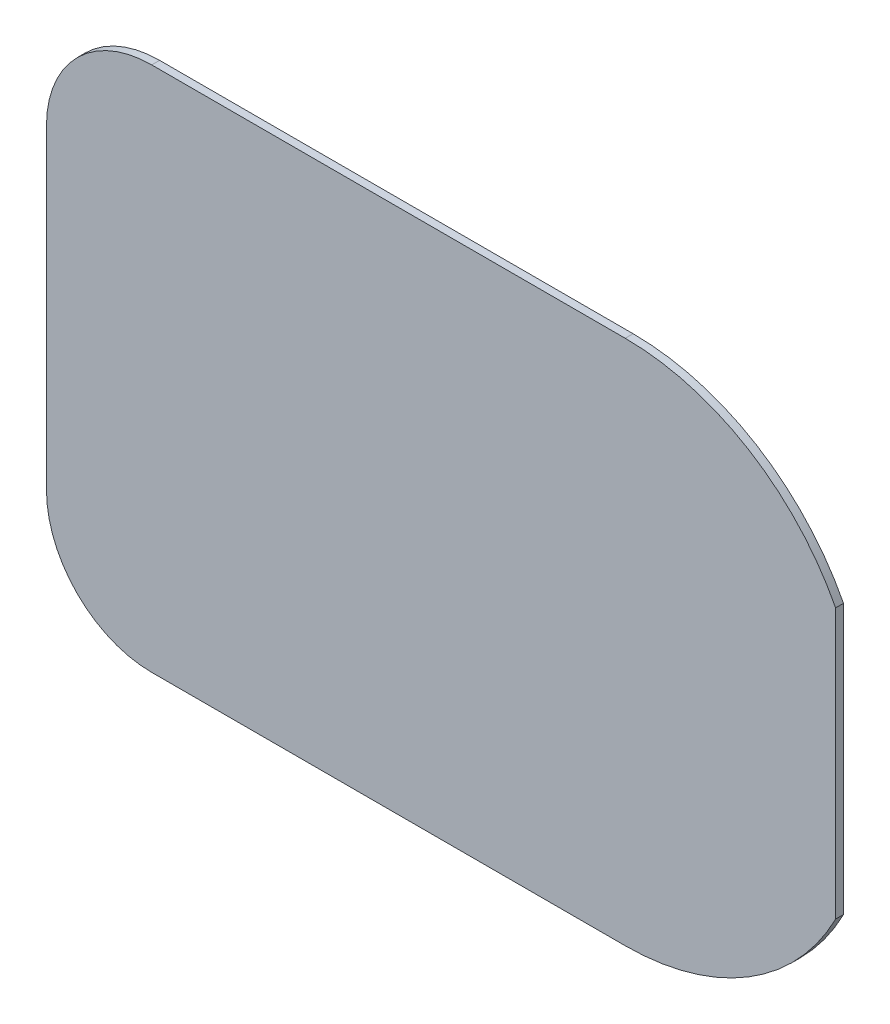
ISO-10303-21;
HEADER;
FILE_DESCRIPTION(('STEP AP214'),'2;1');
FILE_NAME('part.step','',(''),(''),'','','');
FILE_SCHEMA(('AUTOMOTIVE_DESIGN { 1 0 10303 214 1 1 1 1 }'));
ENDSEC;
DATA;
#1=APPLICATION_CONTEXT('core data for automotive mechanical design processes');
#2=APPLICATION_PROTOCOL_DEFINITION('international standard','automotive_design',2000,#1);
#3=PRODUCT_CONTEXT('',#1,'mechanical');
#4=PRODUCT('Part','Part','',(#3));
#5=PRODUCT_RELATED_PRODUCT_CATEGORY('part','',(#4));
#6=PRODUCT_DEFINITION_FORMATION('','',#4);
#7=PRODUCT_DEFINITION_CONTEXT('part definition',#1,'design');
#8=PRODUCT_DEFINITION('design','',#6,#7);
#9=PRODUCT_DEFINITION_SHAPE('','',#8);
#10=(LENGTH_UNIT() NAMED_UNIT(*) SI_UNIT(.MILLI.,.METRE.));
#11=(NAMED_UNIT(*) PLANE_ANGLE_UNIT() SI_UNIT($,.RADIAN.));
#12=(NAMED_UNIT(*) SI_UNIT($,.STERADIAN.) SOLID_ANGLE_UNIT());
#13=UNCERTAINTY_MEASURE_WITH_UNIT(LENGTH_MEASURE(1.E-05),#10,'distance_accuracy_value','');
#14=(GEOMETRIC_REPRESENTATION_CONTEXT(3) GLOBAL_UNCERTAINTY_ASSIGNED_CONTEXT((#13)) GLOBAL_UNIT_ASSIGNED_CONTEXT((#10,
#11,#12)) REPRESENTATION_CONTEXT('',''));
#15=CARTESIAN_POINT('',(0.,0.,0.));
#16=DIRECTION('',(0.,0.,1.));
#17=DIRECTION('',(1.,0.,0.));
#18=AXIS2_PLACEMENT_3D('',#15,#16,#17);
#19=CARTESIAN_POINT('',(0.,0.,3.));
#20=DIRECTION('',(0.,1.,0.));
#21=DIRECTION('',(1.,0.,0.));
#22=AXIS2_PLACEMENT_3D('',#19,#20,#21);
#23=PLANE('',#22);
#24=DIRECTION('',(0.,0.,1.));
#25=VECTOR('',#24,1.);
#26=CARTESIAN_POINT('',(40.,0.,3.));
#27=LINE('',#26,#25);
#28=CARTESIAN_POINT('',(40.,0.,0.));
#29=VERTEX_POINT('',#28);
#30=CARTESIAN_POINT('',(40.,0.,3.));
#31=VERTEX_POINT('',#30);
#32=EDGE_CURVE('E64',#29,#31,#27,.T.);
#33=ORIENTED_EDGE('',*,*,#32,.F.);
#34=DIRECTION('',(-1.,0.,0.));
#35=VECTOR('',#34,1.);
#36=CARTESIAN_POINT('',(220.,0.,0.));
#37=LINE('',#36,#35);
#38=CARTESIAN_POINT('',(220.,0.,0.));
#39=VERTEX_POINT('',#38);
#40=EDGE_CURVE('E143',#29,#39,#37,.F.);
#41=ORIENTED_EDGE('',*,*,#40,.T.);
#42=DIRECTION('',(0.,0.,1.));
#43=VECTOR('',#42,1.);
#44=CARTESIAN_POINT('',(220.,0.,3.));
#45=LINE('',#44,#43);
#46=CARTESIAN_POINT('',(220.,0.,3.));
#47=VERTEX_POINT('',#46);
#48=EDGE_CURVE('E136',#39,#47,#45,.T.);
#49=ORIENTED_EDGE('',*,*,#48,.T.);
#50=DIRECTION('',(1.,0.,0.));
#51=VECTOR('',#50,1.);
#52=CARTESIAN_POINT('',(0.,0.,3.));
#53=LINE('',#52,#51);
#54=EDGE_CURVE('E159',#31,#47,#53,.T.);
#55=ORIENTED_EDGE('',*,*,#54,.F.);
#56=EDGE_LOOP('',(#33,#41,#49,#55));
#57=FACE_BOUND('',#56,.T.);
#58=ADVANCED_FACE('F40',(#57),#23,.F.);
#59=CARTESIAN_POINT('',(220.,90.,3.));
#60=DIRECTION('',(0.,0.,1.));
#61=DIRECTION('',(1.,0.,0.));
#62=AXIS2_PLACEMENT_3D('',#59,#60,#61);
#63=CYLINDRICAL_SURFACE('',#62,90.);
#64=DIRECTION('',(0.,0.,1.));
#65=VECTOR('',#64,1.);
#66=CARTESIAN_POINT('',(300.,48.7689437438234,3.));
#67=LINE('',#66,#65);
#68=CARTESIAN_POINT('',(300.,48.7689437438234,3.));
#69=VERTEX_POINT('',#68);
#70=CARTESIAN_POINT('',(300.,48.7689437438234,0.));
#71=VERTEX_POINT('',#70);
#72=EDGE_CURVE('E115',#69,#71,#67,.F.);
#73=ORIENTED_EDGE('',*,*,#72,.F.);
#74=CARTESIAN_POINT('',(220.,90.,3.));
#75=DIRECTION('',(0.,0.,1.));
#76=DIRECTION('',(-1.,0.,0.));
#77=AXIS2_PLACEMENT_3D('',#74,#75,#76);
#78=CIRCLE('',#77,90.);
#79=EDGE_CURVE('E147',#47,#69,#78,.T.);
#80=ORIENTED_EDGE('',*,*,#79,.F.);
#81=ORIENTED_EDGE('',*,*,#48,.F.);
#82=CARTESIAN_POINT('',(220.,90.,0.));
#83=DIRECTION('',(0.,0.,1.));
#84=DIRECTION('',(1.,0.,0.));
#85=AXIS2_PLACEMENT_3D('',#82,#83,#84);
#86=CIRCLE('',#85,90.);
#87=EDGE_CURVE('E130',#39,#71,#86,.T.);
#88=ORIENTED_EDGE('',*,*,#87,.T.);
#89=EDGE_LOOP('',(#73,#80,#81,#88));
#90=FACE_BOUND('',#89,.T.);
#91=ADVANCED_FACE('F135',(#90),#63,.T.);
#92=CARTESIAN_POINT('',(40.,40.,3.));
#93=DIRECTION('',(0.,0.,-1.));
#94=DIRECTION('',(-1.,0.,0.));
#95=AXIS2_PLACEMENT_3D('',#92,#93,#94);
#96=CYLINDRICAL_SURFACE('',#95,40.);
#97=CARTESIAN_POINT('',(40.,40.,0.));
#98=DIRECTION('',(0.,0.,-1.));
#99=DIRECTION('',(-1.,0.,0.));
#100=AXIS2_PLACEMENT_3D('',#97,#98,#99);
#101=CIRCLE('',#100,40.);
#102=CARTESIAN_POINT('',(0.,40.,0.));
#103=VERTEX_POINT('',#102);
#104=EDGE_CURVE('E138',#103,#29,#101,.F.);
#105=ORIENTED_EDGE('',*,*,#104,.T.);
#106=ORIENTED_EDGE('',*,*,#32,.T.);
#107=CARTESIAN_POINT('',(40.,40.,3.));
#108=DIRECTION('',(0.,0.,-1.));
#109=DIRECTION('',(-1.,0.,0.));
#110=AXIS2_PLACEMENT_3D('',#107,#108,#109);
#111=CIRCLE('',#110,40.);
#112=CARTESIAN_POINT('',(0.,40.,3.));
#113=VERTEX_POINT('',#112);
#114=EDGE_CURVE('E162',#113,#31,#111,.F.);
#115=ORIENTED_EDGE('',*,*,#114,.F.);
#116=DIRECTION('',(0.,0.,1.));
#117=VECTOR('',#116,1.);
#118=CARTESIAN_POINT('',(0.,40.,3.));
#119=LINE('',#118,#117);
#120=EDGE_CURVE('E154',#103,#113,#119,.T.);
#121=ORIENTED_EDGE('',*,*,#120,.F.);
#122=EDGE_LOOP('',(#105,#106,#115,#121));
#123=FACE_BOUND('',#122,.T.);
#124=ADVANCED_FACE('F42',(#123),#96,.T.);
#125=CARTESIAN_POINT('',(220.,90.,3.));
#126=DIRECTION('',(0.,0.,-1.));
#127=DIRECTION('',(-1.,0.,0.));
#128=AXIS2_PLACEMENT_3D('',#125,#126,#127);
#129=PLANE('',#128);
#130=ORIENTED_EDGE('',*,*,#79,.T.);
#131=DIRECTION('',(0.,1.,0.));
#132=VECTOR('',#131,1.);
#133=CARTESIAN_POINT('',(300.,90.,3.));
#134=LINE('',#133,#132);
#135=CARTESIAN_POINT('',(300.,151.231056256177,3.));
#136=VERTEX_POINT('',#135);
#137=EDGE_CURVE('E118',#69,#136,#134,.T.);
#138=ORIENTED_EDGE('',*,*,#137,.T.);
#139=CARTESIAN_POINT('',(220.,110.,3.));
#140=DIRECTION('',(0.,0.,-1.));
#141=DIRECTION('',(-1.,0.,0.));
#142=AXIS2_PLACEMENT_3D('',#139,#140,#141);
#143=CIRCLE('',#142,90.);
#144=CARTESIAN_POINT('',(220.,200.,3.));
#145=VERTEX_POINT('',#144);
#146=EDGE_CURVE('E170',#145,#136,#143,.T.);
#147=ORIENTED_EDGE('',*,*,#146,.F.);
#148=DIRECTION('',(1.,0.,0.));
#149=VECTOR('',#148,1.);
#150=CARTESIAN_POINT('',(0.,200.,3.));
#151=LINE('',#150,#149);
#152=CARTESIAN_POINT('',(40.,200.,3.));
#153=VERTEX_POINT('',#152);
#154=EDGE_CURVE('E190',#153,#145,#151,.T.);
#155=ORIENTED_EDGE('',*,*,#154,.F.);
#156=CARTESIAN_POINT('',(40.,160.,3.));
#157=DIRECTION('',(0.,0.,1.));
#158=DIRECTION('',(-1.,0.,0.));
#159=AXIS2_PLACEMENT_3D('',#156,#157,#158);
#160=CIRCLE('',#159,40.);
#161=CARTESIAN_POINT('',(0.,160.,3.));
#162=VERTEX_POINT('',#161);
#163=EDGE_CURVE('E175',#162,#153,#160,.F.);
#164=ORIENTED_EDGE('',*,*,#163,.F.);
#165=DIRECTION('',(0.,-1.,0.));
#166=VECTOR('',#165,1.);
#167=CARTESIAN_POINT('',(0.,0.,3.));
#168=LINE('',#167,#166);
#169=EDGE_CURVE('E84',#162,#113,#168,.T.);
#170=ORIENTED_EDGE('',*,*,#169,.T.);
#171=ORIENTED_EDGE('',*,*,#114,.T.);
#172=ORIENTED_EDGE('',*,*,#54,.T.);
#173=EDGE_LOOP('',(#130,#138,#147,#155,#164,#170,#171,#172));
#174=FACE_BOUND('',#173,.T.);
#175=ADVANCED_FACE('F197',(#174),#129,.F.);
#176=CARTESIAN_POINT('',(220.,90.,0.));
#177=DIRECTION('',(0.,0.,-1.));
#178=DIRECTION('',(-1.,0.,0.));
#179=AXIS2_PLACEMENT_3D('',#176,#177,#178);
#180=PLANE('',#179);
#181=DIRECTION('',(0.,1.,0.));
#182=VECTOR('',#181,1.);
#183=CARTESIAN_POINT('',(300.,186.573352945452,0.));
#184=LINE('',#183,#182);
#185=CARTESIAN_POINT('',(300.,151.231056256177,0.));
#186=VERTEX_POINT('',#185);
#187=EDGE_CURVE('E55',#71,#186,#184,.T.);
#188=ORIENTED_EDGE('',*,*,#187,.F.);
#189=ORIENTED_EDGE('',*,*,#87,.F.);
#190=ORIENTED_EDGE('',*,*,#40,.F.);
#191=ORIENTED_EDGE('',*,*,#104,.F.);
#192=DIRECTION('',(0.,-1.,0.));
#193=VECTOR('',#192,1.);
#194=CARTESIAN_POINT('',(0.,90.,0.));
#195=LINE('',#194,#193);
#196=CARTESIAN_POINT('',(0.,160.,0.));
#197=VERTEX_POINT('',#196);
#198=EDGE_CURVE('E49',#197,#103,#195,.T.);
#199=ORIENTED_EDGE('',*,*,#198,.F.);
#200=CARTESIAN_POINT('',(40.,160.,0.));
#201=DIRECTION('',(0.,0.,1.));
#202=DIRECTION('',(-1.,0.,0.));
#203=AXIS2_PLACEMENT_3D('',#200,#201,#202);
#204=CIRCLE('',#203,40.);
#205=CARTESIAN_POINT('',(40.,200.,0.));
#206=VERTEX_POINT('',#205);
#207=EDGE_CURVE('E176',#197,#206,#204,.F.);
#208=ORIENTED_EDGE('',*,*,#207,.T.);
#209=DIRECTION('',(-1.,0.,0.));
#210=VECTOR('',#209,1.);
#211=CARTESIAN_POINT('',(220.,200.,0.));
#212=LINE('',#211,#210);
#213=CARTESIAN_POINT('',(220.,200.,0.));
#214=VERTEX_POINT('',#213);
#215=EDGE_CURVE('E124',#206,#214,#212,.F.);
#216=ORIENTED_EDGE('',*,*,#215,.T.);
#217=CARTESIAN_POINT('',(220.,110.,0.));
#218=DIRECTION('',(0.,0.,-1.));
#219=DIRECTION('',(1.,0.,0.));
#220=AXIS2_PLACEMENT_3D('',#217,#218,#219);
#221=CIRCLE('',#220,90.);
#222=EDGE_CURVE('E132',#214,#186,#221,.T.);
#223=ORIENTED_EDGE('',*,*,#222,.T.);
#224=EDGE_LOOP('',(#188,#189,#190,#191,#199,#208,#216,#223));
#225=FACE_BOUND('',#224,.T.);
#226=ADVANCED_FACE('F129',(#225),#180,.T.);
#227=CARTESIAN_POINT('',(0.,166.,0.));
#228=DIRECTION('',(1.,0.,0.));
#229=DIRECTION('',(0.,0.,-1.));
#230=AXIS2_PLACEMENT_3D('',#227,#228,#229);
#231=PLANE('',#230);
#232=ORIENTED_EDGE('',*,*,#169,.F.);
#233=DIRECTION('',(0.,0.,1.));
#234=VECTOR('',#233,1.);
#235=CARTESIAN_POINT('',(0.,160.,3.));
#236=LINE('',#235,#234);
#237=EDGE_CURVE('E150',#197,#162,#236,.T.);
#238=ORIENTED_EDGE('',*,*,#237,.F.);
#239=ORIENTED_EDGE('',*,*,#198,.T.);
#240=ORIENTED_EDGE('',*,*,#120,.T.);
#241=EDGE_LOOP('',(#232,#238,#239,#240));
#242=FACE_BOUND('',#241,.T.);
#243=ADVANCED_FACE('F209',(#242),#231,.F.);
#244=CARTESIAN_POINT('',(0.,200.,3.));
#245=DIRECTION('',(0.,-1.,0.));
#246=DIRECTION('',(1.,0.,0.));
#247=AXIS2_PLACEMENT_3D('',#244,#245,#246);
#248=PLANE('',#247);
#249=DIRECTION('',(0.,0.,1.));
#250=VECTOR('',#249,1.);
#251=CARTESIAN_POINT('',(40.,200.,3.));
#252=LINE('',#251,#250);
#253=EDGE_CURVE('E171',#206,#153,#252,.T.);
#254=ORIENTED_EDGE('',*,*,#253,.T.);
#255=ORIENTED_EDGE('',*,*,#154,.T.);
#256=DIRECTION('',(0.,0.,1.));
#257=VECTOR('',#256,1.);
#258=CARTESIAN_POINT('',(220.,200.,3.));
#259=LINE('',#258,#257);
#260=EDGE_CURVE('E177',#214,#145,#259,.T.);
#261=ORIENTED_EDGE('',*,*,#260,.F.);
#262=ORIENTED_EDGE('',*,*,#215,.F.);
#263=EDGE_LOOP('',(#254,#255,#261,#262));
#264=FACE_BOUND('',#263,.T.);
#265=ADVANCED_FACE('F204',(#264),#248,.F.);
#266=CARTESIAN_POINT('',(220.,110.,3.));
#267=DIRECTION('',(0.,0.,1.));
#268=DIRECTION('',(1.,0.,0.));
#269=AXIS2_PLACEMENT_3D('',#266,#267,#268);
#270=CYLINDRICAL_SURFACE('',#269,90.);
#271=DIRECTION('',(0.,0.,1.));
#272=VECTOR('',#271,1.);
#273=CARTESIAN_POINT('',(300.,151.231056256177,3.));
#274=LINE('',#273,#272);
#275=EDGE_CURVE('E11',#186,#136,#274,.T.);
#276=ORIENTED_EDGE('',*,*,#275,.F.);
#277=ORIENTED_EDGE('',*,*,#222,.F.);
#278=ORIENTED_EDGE('',*,*,#260,.T.);
#279=ORIENTED_EDGE('',*,*,#146,.T.);
#280=EDGE_LOOP('',(#276,#277,#278,#279));
#281=FACE_BOUND('',#280,.T.);
#282=ADVANCED_FACE('F200',(#281),#270,.T.);
#283=CARTESIAN_POINT('',(40.,160.,3.));
#284=DIRECTION('',(0.,0.,-1.));
#285=DIRECTION('',(-1.,0.,0.));
#286=AXIS2_PLACEMENT_3D('',#283,#284,#285);
#287=CYLINDRICAL_SURFACE('',#286,40.);
#288=ORIENTED_EDGE('',*,*,#207,.F.);
#289=ORIENTED_EDGE('',*,*,#237,.T.);
#290=ORIENTED_EDGE('',*,*,#163,.T.);
#291=ORIENTED_EDGE('',*,*,#253,.F.);
#292=EDGE_LOOP('',(#288,#289,#290,#291));
#293=FACE_BOUND('',#292,.T.);
#294=ADVANCED_FACE('F208',(#293),#287,.T.);
#295=CARTESIAN_POINT('',(300.,186.573352945452,10.));
#296=DIRECTION('',(-1.,0.,0.));
#297=DIRECTION('',(0.,0.,1.));
#298=AXIS2_PLACEMENT_3D('',#295,#296,#297);
#299=PLANE('',#298);
#300=ORIENTED_EDGE('',*,*,#72,.T.);
#301=ORIENTED_EDGE('',*,*,#187,.T.);
#302=ORIENTED_EDGE('',*,*,#275,.T.);
#303=ORIENTED_EDGE('',*,*,#137,.F.);
#304=EDGE_LOOP('',(#300,#301,#302,#303));
#305=FACE_BOUND('',#304,.T.);
#306=ADVANCED_FACE('F116',(#305),#299,.F.);
#307=CLOSED_SHELL('',(#58,#91,#124,#175,#226,#243,#265,#282,#294,#306));
#308=MANIFOLD_SOLID_BREP('B2',#307);
#309=ADVANCED_BREP_SHAPE_REPRESENTATION('',(#18,#308),#14);
#310=SHAPE_DEFINITION_REPRESENTATION(#9,#309);
ENDSEC;
END-ISO-10303-21;
